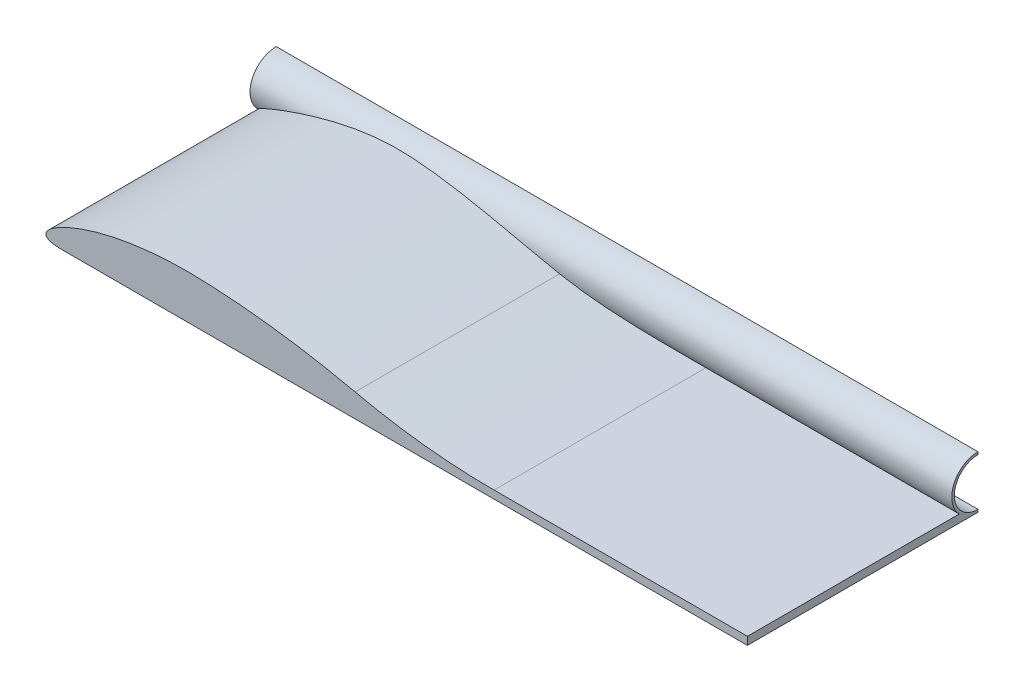
ISO-10303-21;
HEADER;
FILE_DESCRIPTION(('STEP AP214'),'2;1');
FILE_NAME('part.step','',(''),(''),'','','');
FILE_SCHEMA(('AUTOMOTIVE_DESIGN { 1 0 10303 214 1 1 1 1 }'));
ENDSEC;
DATA;
#1=APPLICATION_CONTEXT('core data for automotive mechanical design processes');
#2=APPLICATION_PROTOCOL_DEFINITION('international standard','automotive_design',2000,#1);
#3=PRODUCT_CONTEXT('',#1,'mechanical');
#4=PRODUCT('Part','Part','',(#3));
#5=PRODUCT_RELATED_PRODUCT_CATEGORY('part','',(#4));
#6=PRODUCT_DEFINITION_FORMATION('','',#4);
#7=PRODUCT_DEFINITION_CONTEXT('part definition',#1,'design');
#8=PRODUCT_DEFINITION('design','',#6,#7);
#9=PRODUCT_DEFINITION_SHAPE('','',#8);
#10=(LENGTH_UNIT() NAMED_UNIT(*) SI_UNIT(.MILLI.,.METRE.));
#11=(NAMED_UNIT(*) PLANE_ANGLE_UNIT() SI_UNIT($,.RADIAN.));
#12=(NAMED_UNIT(*) SI_UNIT($,.STERADIAN.) SOLID_ANGLE_UNIT());
#13=UNCERTAINTY_MEASURE_WITH_UNIT(LENGTH_MEASURE(1.E-05),#10,'distance_accuracy_value','');
#14=(GEOMETRIC_REPRESENTATION_CONTEXT(3) GLOBAL_UNCERTAINTY_ASSIGNED_CONTEXT((#13)) GLOBAL_UNIT_ASSIGNED_CONTEXT((#10,
#11,#12)) REPRESENTATION_CONTEXT('',''));
#15=CARTESIAN_POINT('',(0.,0.,0.));
#16=DIRECTION('',(0.,0.,1.));
#17=DIRECTION('',(1.,0.,0.));
#18=AXIS2_PLACEMENT_3D('',#15,#16,#17);
#19=CARTESIAN_POINT('',(0.,0.,0.));
#20=DIRECTION('',(0.,0.,1.));
#21=DIRECTION('',(1.,0.,0.));
#22=AXIS2_PLACEMENT_3D('',#19,#20,#21);
#23=PLANE('',#22);
#24=DIRECTION('',(0.,1.,0.));
#25=VECTOR('',#24,1.);
#26=CARTESIAN_POINT('',(563.88,0.,0.));
#27=LINE('',#26,#25);
#28=CARTESIAN_POINT('',(563.88,36.4773533691907,0.));
#29=VERTEX_POINT('',#28);
#30=CARTESIAN_POINT('',(563.88,38.5093533691907,0.));
#31=VERTEX_POINT('',#30);
#32=EDGE_CURVE('E109',#29,#31,#27,.T.);
#33=ORIENTED_EDGE('',*,*,#32,.F.);
#34=DIRECTION('',(-1.,0.,0.));
#35=VECTOR('',#34,1.);
#36=CARTESIAN_POINT('',(563.88,36.4773533691907,0.));
#37=LINE('',#36,#35);
#38=CARTESIAN_POINT('',(-0.366692026212409,36.4773533691907,0.));
#39=VERTEX_POINT('',#38);
#40=EDGE_CURVE('E97',#29,#39,#37,.T.);
#41=ORIENTED_EDGE('',*,*,#40,.T.);
#42=DIRECTION('',(0.,1.,0.));
#43=VECTOR('',#42,1.);
#44=CARTESIAN_POINT('',(-0.366692026212367,-3.65464663080933,0.));
#45=LINE('',#44,#43);
#46=CARTESIAN_POINT('',(-0.366692026212367,38.5093533691907,0.));
#47=VERTEX_POINT('',#46);
#48=EDGE_CURVE('E214',#39,#47,#45,.T.);
#49=ORIENTED_EDGE('',*,*,#48,.T.);
#50=DIRECTION('',(-1.,0.,0.));
#51=VECTOR('',#50,1.);
#52=CARTESIAN_POINT('',(563.88,38.5093533691907,0.));
#53=LINE('',#52,#51);
#54=EDGE_CURVE('E116',#31,#47,#53,.T.);
#55=ORIENTED_EDGE('',*,*,#54,.F.);
#56=EDGE_LOOP('',(#33,#41,#49,#55));
#57=FACE_BOUND('',#56,.T.);
#58=ADVANCED_FACE('F35',(#57),#23,.F.);
#59=CARTESIAN_POINT('',(0.,2.69535336919036,185.42));
#60=DIRECTION('',(0.,-1.,0.));
#61=DIRECTION('',(1.,0.,0.));
#62=AXIS2_PLACEMENT_3D('',#59,#60,#61);
#63=PLANE('',#62);
#64=DIRECTION('',(-1.,0.,0.));
#65=VECTOR('',#64,1.);
#66=CARTESIAN_POINT('',(563.88,2.69535336919067,15.0804144505382));
#67=LINE('',#66,#65);
#68=CARTESIAN_POINT('',(360.180421151929,2.69535336919025,15.0804144505377));
#69=VERTEX_POINT('',#68);
#70=CARTESIAN_POINT('',(563.88,2.69535336919067,15.0804144505382));
#71=VERTEX_POINT('',#70);
#72=EDGE_CURVE('E121',#69,#71,#67,.F.);
#73=ORIENTED_EDGE('',*,*,#72,.F.);
#74=DIRECTION('',(0.,0.,1.));
#75=VECTOR('',#74,1.);
#76=CARTESIAN_POINT('',(360.180421151928,2.69535336919056,185.42));
#77=LINE('',#76,#75);
#78=CARTESIAN_POINT('',(360.180421151928,2.69535336919056,185.42));
#79=VERTEX_POINT('',#78);
#80=EDGE_CURVE('E137',#69,#79,#77,.T.);
#81=ORIENTED_EDGE('',*,*,#80,.T.);
#82=DIRECTION('',(-1.,0.,0.));
#83=VECTOR('',#82,1.);
#84=CARTESIAN_POINT('',(0.,2.69535336919036,185.42));
#85=LINE('',#84,#83);
#86=CARTESIAN_POINT('',(563.88,2.69535336919067,185.42));
#87=VERTEX_POINT('',#86);
#88=EDGE_CURVE('E120',#87,#79,#85,.T.);
#89=ORIENTED_EDGE('',*,*,#88,.F.);
#90=DIRECTION('',(0.,0.,-1.));
#91=VECTOR('',#90,1.);
#92=CARTESIAN_POINT('',(563.88,2.69535336919067,185.42));
#93=LINE('',#92,#91);
#94=EDGE_CURVE('E125',#87,#71,#93,.T.);
#95=ORIENTED_EDGE('',*,*,#94,.T.);
#96=EDGE_LOOP('',(#73,#81,#89,#95));
#97=FACE_BOUND('',#96,.T.);
#98=ADVANCED_FACE('F174',(#97),#63,.F.);
#99=CARTESIAN_POINT('',(304.8,0.,185.42));
#100=CARTESIAN_POINT('',(304.806765113415,0.0297936907438,185.42));
#101=CARTESIAN_POINT('',(303.042265442166,0.505757681104882,185.42));
#102=CARTESIAN_POINT('',(301.260699107524,1.13128828679422,185.42));
#103=CARTESIAN_POINT('',(296.859481645383,2.43138214292342,185.42));
#104=CARTESIAN_POINT('',(291.428347563501,4.05950750692163,185.42));
#105=CARTESIAN_POINT('',(284.271481229636,6.10623828707882,185.42));
#106=CARTESIAN_POINT('',(275.759062516084,8.44101190552645,185.42));
#107=CARTESIAN_POINT('',(265.867595029522,11.0139121726236,185.42));
#108=CARTESIAN_POINT('',(254.72828410266,13.7239516275996,185.42));
#109=CARTESIAN_POINT('',(242.45219776627,16.501342019607,185.42));
#110=CARTESIAN_POINT('',(229.161916522714,19.2494538440017,185.42));
#111=CARTESIAN_POINT('',(215.002240334106,21.8918598082205,185.42));
#112=CARTESIAN_POINT('',(200.122077246214,24.3476644337164,185.42));
#113=CARTESIAN_POINT('',(184.681833301631,26.5449418917091,185.42));
#114=CARTESIAN_POINT('',(168.851714947921,28.4233907056108,185.42));
#115=CARTESIAN_POINT('',(152.808183208541,29.930661937332,185.42));
#116=CARTESIAN_POINT('',(136.726583628561,31.0048710051825,185.42));
#117=CARTESIAN_POINT('',(120.705050439528,31.6889083800929,185.42));
#118=CARTESIAN_POINT('',(104.91367571592,31.6961733177902,185.42));
#119=CARTESIAN_POINT('',(89.5648924045714,30.8862286831657,185.42));
#120=CARTESIAN_POINT('',(74.9378034426248,29.3709102924395,185.42));
#121=CARTESIAN_POINT('',(61.2207309550213,27.2233169079844,185.42));
#122=CARTESIAN_POINT('',(48.5867513337238,24.5540455106148,185.42));
#123=CARTESIAN_POINT('',(37.1861333906392,21.5011014723962,185.42));
#124=CARTESIAN_POINT('',(27.1552746614983,18.1970778873359,185.42));
#125=CARTESIAN_POINT('',(18.5969283006425,14.8044671458805,185.42));
#126=CARTESIAN_POINT('',(11.6063717286755,11.4360388322654,185.42));
#127=CARTESIAN_POINT('',(6.20537461581932,8.26316028915888,185.42));
#128=CARTESIAN_POINT('',(2.4620711553724,5.3102193566351,185.42));
#129=CARTESIAN_POINT('',(0.172825892274397,2.71807809904705,185.42));
#130=CARTESIAN_POINT('',(-0.366692026212387,-0.106725709936372,185.42));
#131=CARTESIAN_POINT('',(1.61853864418734,-2.17519153343636,185.42));
#132=CARTESIAN_POINT('',(4.90312913802598,-3.1117877974165,185.42));
#133=CARTESIAN_POINT('',(9.54050066961738,-3.65904451106276,185.42));
#134=CARTESIAN_POINT('',(15.6223250235567,-3.68468011379504,185.42));
#135=CARTESIAN_POINT('',(23.0877165309997,-3.30949507157914,185.42));
#136=CARTESIAN_POINT('',(31.8617424793389,-2.56072504363965,185.42));
#137=CARTESIAN_POINT('',(41.8437098749915,-1.53618962834286,185.42));
#138=CARTESIAN_POINT('',(52.9319861205823,-0.324549042889645,185.42));
#139=CARTESIAN_POINT('',(65.0085126482625,0.982737612858198,185.42));
#140=CARTESIAN_POINT('',(77.9641225568185,2.27751163277432,185.42));
#141=CARTESIAN_POINT('',(91.6740314858693,3.44660128053989,185.42));
#142=CARTESIAN_POINT('',(106.020407657375,4.41212483885966,185.42));
#143=CARTESIAN_POINT('',(120.95534562256,5.05177624345621,185.42));
#144=CARTESIAN_POINT('',(136.33914130998,5.41029723383236,185.42));
#145=CARTESIAN_POINT('',(152.007716340095,5.72933017095042,185.42));
#146=CARTESIAN_POINT('',(167.715786189237,5.89135553497832,185.42));
#147=CARTESIAN_POINT('',(183.286749282816,5.90781947795733,185.42));
#148=CARTESIAN_POINT('',(198.553027184666,5.75950083301546,185.42));
#149=CARTESIAN_POINT('',(213.347799024157,5.45737661505621,185.42));
#150=CARTESIAN_POINT('',(227.508384673819,5.01338248731081,185.42));
#151=CARTESIAN_POINT('',(240.877077650288,4.45854649480439,185.42));
#152=CARTESIAN_POINT('',(253.302348041566,3.81956254234677,185.42));
#153=CARTESIAN_POINT('',(264.636493620716,3.14064435260617,185.42));
#154=CARTESIAN_POINT('',(274.759317931257,2.45167335072776,185.42));
#155=CARTESIAN_POINT('',(283.511762664263,1.80333800911344,185.42));
#156=CARTESIAN_POINT('',(290.902443864489,1.20739442477992,185.42));
#157=CARTESIAN_POINT('',(296.536660630331,0.742433739926797,185.42));
#158=CARTESIAN_POINT('',(301.097723541562,0.310240549260641,185.42));
#159=CARTESIAN_POINT('',(302.984341567181,0.206591885939164,185.42));
#160=CARTESIAN_POINT('',(304.793276654245,-0.0296097451566188,185.42));
#161=CARTESIAN_POINT('',(304.8,0.,185.42));
#162=B_SPLINE_CURVE_WITH_KNOTS('',3,(#99,#100,#101,#102,#103,#104,#105,#106,#107,#108,#109,#110,
#111,#112,#113,#114,#115,#116,#117,#118,#119,#120,#121,#122,#123,#124,#125,#126,#127,#128,#129,
#130,#131,#132,#133,#134,#135,#136,#137,#138,#139,#140,#141,#142,#143,#144,#145,#146,#147,#148,
#149,#150,#151,#152,#153,#154,#155,#156,#157,#158,#159,#160,#161),.UNSPECIFIED.,.T.,.F.,(4,1,1,
1,1,1,1,1,1,1,1,1,1,1,1,1,1,1,1,1,1,1,1,1,1,1,1,1,1,1,1,1,1,1,1,1,1,1,1,1,1,1,1,1,1,1,1,1,1,1,1,
1,1,1,1,1,1,1,1,1,4),(0.,0.00137455348322331,0.00548449728179396,0.0122733609908927,
0.021682195504866,0.0335806119079948,0.0478307427867091,0.0643059527211734,0.082777332043007,
0.103063756455997,0.124929016786915,0.148149110667858,0.172444694611559,0.197572105868171,
0.223268880537162,0.249227774933554,0.275186209349679,0.300900708934774,0.326462938278696,
0.351222485186767,0.374905858971967,0.397269706218861,0.418072413969665,0.437079533175026,
0.454093093767394,0.468919631578705,0.48139171235289,0.491447126518173,0.499023571234557,
0.504293734329401,0.507921918342,0.511539686153778,0.516780527527172,0.524216490268905,
0.533991629403711,0.546033957270731,0.560220284382465,0.576403357410148,0.594370816485922,
0.613951103581465,0.634916884969972,0.657088503485648,0.680229909573905,0.704175481107386,
0.72909036740664,0.754353775526935,0.779667752347888,0.804760119952374,0.829359338708984,
0.853208710008459,0.876041363199166,0.897604065496152,0.917662212410958,0.935969860405553,
0.952309787739252,0.966502759006892,0.978350082728452,0.987731492337842,0.994510920242662,
0.998633932979557,1.),.UNSPECIFIED.);
#163=DIRECTION('',(0.,0.,-1.));
#164=VECTOR('',#163,1.);
#165=SURFACE_OF_LINEAR_EXTRUSION('',#162,#164);
#166=CARTESIAN_POINT('',(248.468052168918,15.1306788652424,20.9565266736383));
#167=CARTESIAN_POINT('',(247.099112764868,15.4393030736697,20.9903312593925));
#168=CARTESIAN_POINT('',(245.729105769636,15.7439384634841,21.0168359582006));
#169=CARTESIAN_POINT('',(242.98715958145,16.3451319217436,21.0563639623265));
#170=CARTESIAN_POINT('',(241.615220436294,16.6416901864393,21.0693875954799));
#171=CARTESIAN_POINT('',(238.869528993161,17.2266484245325,21.0830734704658));
#172=CARTESIAN_POINT('',(237.495776672501,17.5150482948292,21.0837355561505));
#173=CARTESIAN_POINT('',(234.746598439609,18.0837493381834,21.0736982455053));
#174=CARTESIAN_POINT('',(233.371172479316,18.3640502726612,21.0629985148272));
#175=CARTESIAN_POINT('',(230.618784230446,18.9165921609464,21.0311546658974));
#176=CARTESIAN_POINT('',(229.241821898425,19.1888328805205,21.0100102444336));
#177=CARTESIAN_POINT('',(226.478603793566,19.726789216564,20.9579759444772));
#178=CARTESIAN_POINT('',(225.092340035387,19.9924584219975,20.9270308362591));
#179=CARTESIAN_POINT('',(222.318490622957,20.5155577262323,20.8562551608536));
#180=CARTESIAN_POINT('',(220.930904972023,20.7729878456534,20.8164246159054));
#181=CARTESIAN_POINT('',(218.154524449685,21.279539448282,20.7286626418));
#182=CARTESIAN_POINT('',(216.765729621149,21.5286612146448,20.6807314890565));
#183=CARTESIAN_POINT('',(213.987042349249,22.0185235511418,20.5775249179119));
#184=CARTESIAN_POINT('',(212.597149995387,22.2592647444273,20.5222500470436));
#185=CARTESIAN_POINT('',(209.816387956572,22.7323048063502,20.405086884718));
#186=CARTESIAN_POINT('',(208.425518412209,22.9646047056129,20.3431994042764));
#187=CARTESIAN_POINT('',(203.687559953128,23.741206574207,20.1224069564179));
#188=CARTESIAN_POINT('',(200.337783470012,24.2652725829196,19.9493673129411));
#189=CARTESIAN_POINT('',(193.632531070939,25.2637601399526,19.5786866855983));
#190=CARTESIAN_POINT('',(190.277055644433,25.7381857522002,19.3810477185187));
#191=CARTESIAN_POINT('',(183.559693279163,26.637016380202,18.9704207944893));
#192=CARTESIAN_POINT('',(180.197805254609,27.0614119848369,18.7574299618118));
#193=CARTESIAN_POINT('',(175.150007571353,27.659738281782,18.4336790308048));
#194=CARTESIAN_POINT('',(173.46621229796,27.8528405361202,18.3250270676343));
#195=CARTESIAN_POINT('',(170.097202157166,28.2261269124803,18.1075634703754));
#196=CARTESIAN_POINT('',(168.411987294777,28.4063110799192,17.9987518368499));
#197=CARTESIAN_POINT('',(165.038988742346,28.753632145901,17.7822392233363));
#198=CARTESIAN_POINT('',(163.351204086217,28.9207601574512,17.6745390424266));
#199=CARTESIAN_POINT('',(159.974167283502,29.2413958652244,17.4618481346871));
#200=CARTESIAN_POINT('',(158.284915137923,29.3949035707906,17.3568574059988));
#201=CARTESIAN_POINT('',(155.749114612704,29.6147238866339,17.2025217419631));
#202=CARTESIAN_POINT('',(154.903116246161,29.6862893189819,17.1515776284693));
#203=CARTESIAN_POINT('',(153.210748829141,29.8258455257327,17.050968112794));
#204=CARTESIAN_POINT('',(152.364379778751,29.8938363009811,17.00130271031));
#205=CARTESIAN_POINT('',(149.824732837935,30.0924564399656,16.8544661467356));
#206=CARTESIAN_POINT('',(148.130908282572,30.2177342131065,16.7594542082649));
#207=CARTESIAN_POINT('',(144.751165423068,30.4538681438065,16.5765743088214));
#208=CARTESIAN_POINT('',(143.065254296047,30.5647991228635,16.4886702611101));
#209=CARTESIAN_POINT('',(140.535497050204,30.7213018720414,16.3623390588263));
#210=CARTESIAN_POINT('',(139.692091942442,30.7718207322824,16.3211492753199));
#211=CARTESIAN_POINT('',(138.005003288597,30.8696319326705,16.2406863404359));
#212=CARTESIAN_POINT('',(137.161319742291,30.9169242702283,16.2014131905965));
#213=CARTESIAN_POINT('',(134.629336651519,31.0539885921662,16.0866300822614));
#214=CARTESIAN_POINT('',(132.940628434794,31.1389155038095,16.0141827595993));
#215=CARTESIAN_POINT('',(129.562002759127,31.2926329082582,15.8812824243957));
#216=CARTESIAN_POINT('',(127.872085310135,31.3614235323534,15.8208293142663));
#217=CARTESIAN_POINT('',(124.492561356313,31.4797032865268,15.7158665657651));
#218=CARTESIAN_POINT('',(122.802955914565,31.52920954926,15.6713427783105));
#219=CARTESIAN_POINT('',(119.422806870354,31.6058021333431,15.602084412551));
#220=CARTESIAN_POINT('',(117.732263265546,31.6328883983895,15.5773498839431));
#221=CARTESIAN_POINT('',(114.3528682068,31.6624941981846,15.5503042607257));
#222=CARTESIAN_POINT('',(112.664017291064,31.6650445138589,15.5479650706552));
#223=CARTESIAN_POINT('',(110.130998581018,31.6489812960987,15.5626478946982));
#224=CARTESIAN_POINT('',(109.286699683187,31.6403120582089,15.5705741500456));
#225=CARTESIAN_POINT('',(107.598278875806,31.6160959896825,15.5926454963197));
#226=CARTESIAN_POINT('',(106.754156966041,31.600549167477,15.6067905796232));
#227=CARTESIAN_POINT('',(105.066857319297,31.5623127168644,15.6414293414338));
#228=CARTESIAN_POINT('',(104.223679356776,31.5396286174967,15.6619181054821));
#229=CARTESIAN_POINT('',(102.537728038733,31.4870156943186,15.7091645881915));
#230=CARTESIAN_POINT('',(101.694954683603,31.4570868635079,15.7359223129099));
#231=CARTESIAN_POINT('',(99.1673713850292,31.3565071872956,15.8252191175723));
#232=CARTESIAN_POINT('',(97.4832919611766,31.2750630163911,15.8967819593659));
#233=CARTESIAN_POINT('',(94.1183585926019,31.0836100831535,16.0615460701563));
#234=CARTESIAN_POINT('',(92.4375038113685,30.9736101633857,16.1547406397339));
#235=CARTESIAN_POINT('',(89.9186814431363,30.7873667410885,16.3085012353868));
#236=CARTESIAN_POINT('',(89.0794823739226,30.7217448660866,16.3620830050465));
#237=CARTESIAN_POINT('',(87.4019551736037,30.5833984812229,16.4735272253018));
#238=CARTESIAN_POINT('',(86.5636270399786,30.5106739919689,16.5313896634773));
#239=CARTESIAN_POINT('',(84.5125395286841,30.3238253765889,16.6778735879811));
#240=CARTESIAN_POINT('',(83.3002925535145,30.2057504219486,16.7686618048924));
#241=CARTESIAN_POINT('',(80.8779681137182,29.9542293572377,16.9573823202409));
#242=CARTESIAN_POINT('',(79.6678906260886,29.820783411135,17.0553145424662));
#243=CARTESIAN_POINT('',(77.2492648956912,29.5381482353492,17.2571592486098));
#244=CARTESIAN_POINT('',(76.0407181773908,29.3889487327877,17.3610756144549));
#245=CARTESIAN_POINT('',(73.6261031432983,29.0745987726564,17.5735137438798));
#246=CARTESIAN_POINT('',(72.4200348352933,28.9094482650475,17.6820355219064));
#247=CARTESIAN_POINT('',(70.0097790842015,28.562771233046,17.9023854032609));
#248=CARTESIAN_POINT('',(68.8055932921325,28.3812345173747,18.0142155347256));
#249=CARTESIAN_POINT('',(66.4000128898592,28.0015463227288,18.2396797245532));
#250=CARTESIAN_POINT('',(65.1986182784036,27.8033948512045,18.3533137821071));
#251=CARTESIAN_POINT('',(62.7980243610373,27.3900185139923,18.5809509157368));
#252=CARTESIAN_POINT('',(61.5988268940342,27.1747830660028,18.6949541779101));
#253=CARTESIAN_POINT('',(59.2035470578654,26.7269953655821,18.9216904879018));
#254=CARTESIAN_POINT('',(58.0074646870889,26.494443122106,19.034423536377));
#255=CARTESIAN_POINT('',(55.6191680501046,26.0116865837907,19.2569614376926));
#256=CARTESIAN_POINT('',(54.4269522574135,25.7614904596922,19.3667676138999));
#257=CARTESIAN_POINT('',(52.0460652406215,25.2428909182544,19.5817998184992));
#258=CARTESIAN_POINT('',(50.8573940253433,24.9744874556351,19.6870258354996));
#259=CARTESIAN_POINT('',(48.4842374396399,24.4191694851651,19.8910214003124));
#260=CARTESIAN_POINT('',(47.2997508182784,24.1322611099898,19.9897930655238));
#261=CARTESIAN_POINT('',(44.9349623602635,23.5391022201909,20.1790531938305));
#262=CARTESIAN_POINT('',(43.7546605023463,23.2328518039985,20.2695416990728));
#263=CARTESIAN_POINT('',(41.3997891521572,22.6002912901074,20.4401233852523));
#264=CARTESIAN_POINT('',(40.225215552053,22.2739989548532,20.5202255807644));
#265=CARTESIAN_POINT('',(37.8813221161396,21.6002236220635,20.667773035816));
#266=CARTESIAN_POINT('',(36.7120023783765,21.2527402308152,20.7352180601003));
#267=CARTESIAN_POINT('',(34.3801580163397,20.5357940626232,20.8547438472018));
#268=CARTESIAN_POINT('',(33.2176294378908,20.1663458527581,20.9068346593151));
#269=CARTESIAN_POINT('',(30.8996287895528,19.4040048319452,20.9926354825125));
#270=CARTESIAN_POINT('',(29.7441562812054,19.0111134944166,21.0263466474247));
#271=CARTESIAN_POINT('',(28.1609204401472,18.4539310867058,21.0575399033757));
#272=CARTESIAN_POINT('',(27.7296000620704,18.300203132616,21.0644975269429));
#273=CARTESIAN_POINT('',(26.868187589711,17.989244063447,21.0750850032511));
#274=CARTESIAN_POINT('',(26.4380954830201,17.8320129838993,21.0787148897291));
#275=CARTESIAN_POINT('',(25.1497543288994,17.3548244295112,21.0842784208201));
#276=CARTESIAN_POINT('',(24.2934918443509,17.0293896905407,21.0808848716959));
#277=CARTESIAN_POINT('',(22.5873162475846,16.3623211828166,21.057726153146));
#278=CARTESIAN_POINT('',(21.7374043476888,16.0206844081658,21.0379579345047));
#279=CARTESIAN_POINT('',(20.0485993198864,15.3211554943467,20.979451129247));
#280=CARTESIAN_POINT('',(19.2096771328529,14.9633278799521,20.9407827011848));
#281=CARTESIAN_POINT('',(17.5413803292936,14.2290996288189,20.841288691655));
#282=CARTESIAN_POINT('',(16.712004409275,13.8527015657888,20.7804661731427));
#283=CARTESIAN_POINT('',(15.4770548517145,13.2728584375797,20.6695301810819));
#284=CARTESIAN_POINT('',(15.0669817172029,13.0770653141531,20.6292749389475));
#285=CARTESIAN_POINT('',(14.2501822769942,12.6801754107013,20.5415764990661));
#286=CARTESIAN_POINT('',(13.8434558927213,12.4790787556624,20.4941334705862));
#287=CARTESIAN_POINT('',(13.1618635311451,12.1359258966031,20.4076493086353));
#288=CARTESIAN_POINT('',(12.8859981237364,11.9953231791236,20.370700019397));
#289=CARTESIAN_POINT('',(12.3361588638315,11.7115201712671,20.2928959588571));
#290=CARTESIAN_POINT('',(12.0621850057976,11.5683198884989,20.2520411989941));
#291=CARTESIAN_POINT('',(11.5162324517187,11.279299229351,20.1661817069372));
#292=CARTESIAN_POINT('',(11.2442540000527,11.1334785393493,20.1211764752971));
#293=CARTESIAN_POINT('',(10.7025445289864,10.8391217502256,20.0267279462486));
#294=CARTESIAN_POINT('',(10.4328135048442,10.690585656835,19.9772846582067));
#295=CARTESIAN_POINT('',(9.89443079653266,10.3894936998747,19.8732176903685));
#296=CARTESIAN_POINT('',(9.62579511818293,10.2369191590751,19.8185649006422));
#297=CARTESIAN_POINT('',(9.09170217802112,9.92829251524886,19.7038544428412));
#298=CARTESIAN_POINT('',(8.82624495906186,9.7722403654172,19.6437967019884));
#299=CARTESIAN_POINT('',(8.03551661855911,9.29848842236969,19.4547723205064));
#300=CARTESIAN_POINT('',(7.51567311905697,8.97507343407394,19.3169137860103));
#301=CARTESIAN_POINT('',(6.7461879346282,8.47471203430509,19.0875664460566));
#302=CARTESIAN_POINT('',(6.48935400986463,8.30392732031769,19.0066016301604));
#303=CARTESIAN_POINT('',(5.98126251784846,7.95799049615125,18.8366421013234));
#304=CARTESIAN_POINT('',(5.73000576711389,7.78283775434496,18.7476462221423));
#305=CARTESIAN_POINT('',(5.23389430844291,7.42794718839828,18.5607875763484));
#306=CARTESIAN_POINT('',(4.98904274611483,7.24820719397614,18.4629205546546));
#307=CARTESIAN_POINT('',(4.50675956728217,6.88376943006438,18.2572558156252));
#308=CARTESIAN_POINT('',(4.26933780820467,6.69906563218346,18.149445597));
#309=CARTESIAN_POINT('',(3.80583756662264,6.32688263339939,17.924204131063));
#310=CARTESIAN_POINT('',(3.57966778885662,6.13945125624239,17.8068827727726));
#311=CARTESIAN_POINT('',(3.24794326026086,5.85511898536105,17.6223401833388));
#312=CARTESIAN_POINT('',(3.1386222123292,5.7598095668148,17.5593984461064));
#313=CARTESIAN_POINT('',(2.92263148571995,5.56818930766246,17.4305560135163));
#314=CARTESIAN_POINT('',(2.81596176895711,5.47187848146938,17.3646553607003));
#315=CARTESIAN_POINT('',(2.60556685312168,5.27847494672249,17.2298969203662));
#316=CARTESIAN_POINT('',(2.50183770300641,5.18138353662086,17.1610434469137));
#317=CARTESIAN_POINT('',(2.34844564124036,5.03512951152962,17.0554134663737));
#318=CARTESIAN_POINT('',(2.29767932388815,4.98627280342645,17.0198099383418));
#319=CARTESIAN_POINT('',(2.19688609345535,4.88837669745407,16.9478163610146));
#320=CARTESIAN_POINT('',(2.14685918274869,4.83933729899895,16.9114263091951));
#321=CARTESIAN_POINT('',(1.99817777646345,4.69203387140731,16.8011133754483));
#322=CARTESIAN_POINT('',(1.90076779756164,4.59343755743372,16.7259416290053));
#323=CARTESIAN_POINT('',(1.71034712955726,4.39500542595423,16.5717954616821));
#324=CARTESIAN_POINT('',(1.6173355889835,4.29516985311354,16.4928217828216));
#325=CARTESIAN_POINT('',(1.44202770109712,4.09999093898634,16.3354493109147));
#326=CARTESIAN_POINT('',(1.35942295410864,4.00473072419662,16.2572922751238));
#327=CARTESIAN_POINT('',(1.19979679083388,3.81294419785355,16.0970243853798));
#328=CARTESIAN_POINT('',(1.12277308704261,3.71641842439311,16.0149151745366));
#329=CARTESIAN_POINT('',(0.974988358989928,3.52220848894599,15.8465824534736));
#330=CARTESIAN_POINT('',(0.904225809151934,3.42452461575345,15.7603599534117));
#331=CARTESIAN_POINT('',(0.769505004761096,3.22822834829591,15.5837415540541));
#332=CARTESIAN_POINT('',(0.705546865822586,3.12961593828504,15.4933455838839));
#333=CARTESIAN_POINT('',(0.584799154945228,2.93178923519666,15.3084186674267));
#334=CARTESIAN_POINT('',(0.528012402692753,2.83257472135013,15.2138861142433));
#335=CARTESIAN_POINT('',(0.421821123112524,2.63400755958219,15.0208792540081));
#336=CARTESIAN_POINT('',(0.372417355132203,2.53465489851139,14.9224045428201));
#337=CARTESIAN_POINT('',(0.280811795277042,2.33596262654509,14.7214361372196));
#338=CARTESIAN_POINT('',(0.238634506096255,2.23662415833613,14.6189301639498));
#339=CARTESIAN_POINT('',(0.161540626066773,2.0387482225775,14.4104895039303));
#340=CARTESIAN_POINT('',(0.126623554472804,1.9402107024074,14.3045550447397));
#341=CARTESIAN_POINT('',(0.0641246243668774,1.74429929091532,14.0894888883517));
#342=CARTESIAN_POINT('',(0.0365428870153904,1.64692541883911,13.9803571383765));
#343=CARTESIAN_POINT('',(-0.0110926308184131,1.4538037278131,13.7592860304731));
#344=CARTESIAN_POINT('',(-0.0311553458544166,1.35805410888473,13.6473501744472));
#345=CARTESIAN_POINT('',(-0.0635541480746262,1.16839232315002,13.4208319138483));
#346=CARTESIAN_POINT('',(-0.0758903396037608,1.07448013154624,13.3062495450374));
#347=CARTESIAN_POINT('',(-0.0925262154443618,0.888799221626655,13.0747455189002));
#348=CARTESIAN_POINT('',(-0.09682446227413,0.797030889609472,12.9578234469264));
#349=CARTESIAN_POINT('',(-0.0970076141094968,0.615110229062553,12.7209168424299));
#350=CARTESIAN_POINT('',(-0.0928109113582904,0.52498204813617,12.6009136434611));
#351=CARTESIAN_POINT('',(-0.07538322805831,0.347615393187304,12.3594377909034));
#352=CARTESIAN_POINT('',(-0.0621537303527659,0.260376447326,12.2379653817177));
#353=CARTESIAN_POINT('',(-0.0351654960967089,0.131987647614654,12.0551482428751));
#354=CARTESIAN_POINT('',(-0.0249813789810078,0.0896108386049936,11.9941194844675));
#355=CARTESIAN_POINT('',(-0.00213614411311007,0.00571639336966007,11.8719323953397));
#356=CARTESIAN_POINT('',(0.0105249422586308,-0.0358012537332748,11.8107740662707));
#357=CARTESIAN_POINT('',(0.0382925783671819,-0.118051131918416,11.6882404684464));
#358=CARTESIAN_POINT('',(0.0534055810059697,-0.15878096412908,11.6268650570911));
#359=CARTESIAN_POINT('',(0.0858861994660794,-0.239324829933427,11.5041121067128));
#360=CARTESIAN_POINT('',(0.103253867770717,-0.27913884218357,11.4427345676737));
#361=CARTESIAN_POINT('',(0.158549826701108,-0.397232466348643,11.2586025168384));
#362=CARTESIAN_POINT('',(0.199658627421978,-0.47412753752829,11.1359024442689));
#363=CARTESIAN_POINT('',(0.289292994670165,-0.624214718728156,10.890925833953));
#364=CARTESIAN_POINT('',(0.337821044294873,-0.697405578054606,10.7686494520727));
#365=CARTESIAN_POINT('',(0.461593746020229,-0.868015119158188,10.4770620629348));
#366=CARTESIAN_POINT('',(0.539869537456908,-0.963729046603457,10.3080370931815));
#367=CARTESIAN_POINT('',(0.706950522830006,-1.14834321633418,9.9715128591809));
#368=CARTESIAN_POINT('',(0.795756755010934,-1.23724278533569,9.80401374713089));
#369=CARTESIAN_POINT('',(0.982481247908242,-1.40855811656232,9.47070603597173));
#370=CARTESIAN_POINT('',(1.0804025512969,-1.49097169665662,9.3048980220037));
#371=CARTESIAN_POINT('',(1.23338377872157,-1.60983788828797,9.05783726091451));
#372=CARTESIAN_POINT('',(1.28536954607707,-1.64865135171054,8.97579507336055));
#373=CARTESIAN_POINT('',(1.39134079926786,-1.72473363559898,8.81228798840193));
#374=CARTESIAN_POINT('',(1.44532628145108,-1.76200245888557,8.73082308994329));
#375=CARTESIAN_POINT('',(1.61026984330001,-1.87147123093847,8.48750269709507));
#376=CARTESIAN_POINT('',(1.72426092148852,-1.94136911965673,8.32664723993351));
#377=CARTESIAN_POINT('',(1.96069508562229,-2.07500071730861,8.00866120136738));
#378=CARTESIAN_POINT('',(2.08313702069027,-2.13873526276775,7.85153011666044));
#379=CARTESIAN_POINT('',(2.32025205106857,-2.25223508422951,7.56210637455543));
#380=CARTESIAN_POINT('',(2.43386905446269,-2.30273959946211,7.42923809036316));
#381=CARTESIAN_POINT('',(2.66768414901469,-2.39923927601535,7.167731432319));
#382=CARTESIAN_POINT('',(2.78788184893629,-2.44523470495795,7.03909280773116));
#383=CARTESIAN_POINT('',(3.0345605518836,-2.53287975377603,6.78658082770482));
#384=CARTESIAN_POINT('',(3.16103841115464,-2.57453151628943,6.66270514203081));
#385=CARTESIAN_POINT('',(3.41984347362072,-2.65384408900789,6.41970311679895));
#386=CARTESIAN_POINT('',(3.55217482358797,-2.69150200355551,6.30058026169239));
#387=CARTESIAN_POINT('',(3.82163818650017,-2.7632583887707,6.06670544129596));
#388=CARTESIAN_POINT('',(3.95877186717934,-2.79735560619194,5.95195502392289));
#389=CARTESIAN_POINT('',(4.16693383352442,-2.84629242621028,5.78216817000317));
#390=CARTESIAN_POINT('',(4.23675026304535,-2.86224047317156,5.72594772921973));
#391=CARTESIAN_POINT('',(4.37693713701115,-2.89349525610219,5.61401958031891));
#392=CARTESIAN_POINT('',(4.44730758943695,-2.9088019828129,5.55831187961293));
#393=CARTESIAN_POINT('',(4.64334238126854,-2.95055734885076,5.40388311119408));
#394=CARTESIAN_POINT('',(4.76937397438942,-2.97639608534521,5.30546277106496));
#395=CARTESIAN_POINT('',(5.02256434896766,-3.02631579417228,5.10963395828651));
#396=CARTESIAN_POINT('',(5.14972312830085,-3.05039676981662,5.01222548373107));
#397=CARTESIAN_POINT('',(5.53279106801946,-3.12006310646252,4.7216585807943));
#398=CARTESIAN_POINT('',(5.79037967048077,-3.16309052687104,4.53008936952587));
#399=CARTESIAN_POINT('',(6.30997439882075,-3.24269891231755,4.15175094107866));
#400=CARTESIAN_POINT('',(6.57197987824038,-3.27928081190638,3.96498103139795));
#401=CARTESIAN_POINT('',(7.10044914711469,-3.34644243291669,3.5965548187372));
#402=CARTESIAN_POINT('',(7.36691438745805,-3.37702015813276,3.41490023358317));
#403=CARTESIAN_POINT('',(7.90402602491006,-3.4326232281895,3.05694839654035));
#404=CARTESIAN_POINT('',(8.17467282754521,-3.45764803084829,2.88065166923661));
#405=CARTESIAN_POINT('',(8.58335651540477,-3.49139556664022,2.61998822683417));
#406=CARTESIAN_POINT('',(8.72003899148357,-3.50201328128243,2.53372926167402));
#407=CARTESIAN_POINT('',(8.99416035055496,-3.52205718583431,2.3622809274758));
#408=CARTESIAN_POINT('',(9.13159923539215,-3.53148337283695,2.27709156104774));
#409=CARTESIAN_POINT('',(9.5094669786478,-3.55577217820874,2.04479279296796));
#410=CARTESIAN_POINT('',(9.75058486876727,-3.56947377520652,1.8986796518567));
#411=CARTESIAN_POINT('',(10.2349237558423,-3.5935993442259,1.60974903052906));
#412=CARTESIAN_POINT('',(10.4781445908664,-3.60402356634333,1.46693129961163));
#413=CARTESIAN_POINT('',(10.966612734834,-3.6217965701448,1.18488957325301));
#414=CARTESIAN_POINT('',(11.2118589774766,-3.62914687648535,1.04566382842438));
#415=CARTESIAN_POINT('',(11.7045365353909,-3.64099172573271,0.771009238092358));
#416=CARTESIAN_POINT('',(11.9519678625235,-3.64548625312843,0.635580413215648));
#417=CARTESIAN_POINT('',(12.5021094623985,-3.6525210029813,0.340333266657014));
#418=CARTESIAN_POINT('',(12.8053472636224,-3.65443941449852,0.181478315621073));
#419=CARTESIAN_POINT('',(13.1272001630557,-3.65464133877349,0.017265421892696));
#420=CARTESIAN_POINT('',(13.1441551329531,-3.65464663536664,0.0086276025826738));
#421=CARTESIAN_POINT('',(13.1611152527335,-3.6546466308094,0.));
#422=B_SPLINE_CURVE_WITH_KNOTS('',3,(#166,#167,#168,#169,#170,#171,#172,#173,#174,#175,#176,
#177,#178,#179,#180,#181,#182,#183,#184,#185,#186,#187,#188,#189,#190,#191,#192,#193,#194,#195,
#196,#197,#198,#199,#200,#201,#202,#203,#204,#205,#206,#207,#208,#209,#210,#211,#212,#213,#214,
#215,#216,#217,#218,#219,#220,#221,#222,#223,#224,#225,#226,#227,#228,#229,#230,#231,#232,#233,
#234,#235,#236,#237,#238,#239,#240,#241,#242,#243,#244,#245,#246,#247,#248,#249,#250,#251,#252,
#253,#254,#255,#256,#257,#258,#259,#260,#261,#262,#263,#264,#265,#266,#267,#268,#269,#270,#271,
#272,#273,#274,#275,#276,#277,#278,#279,#280,#281,#282,#283,#284,#285,#286,#287,#288,#289,#290,
#291,#292,#293,#294,#295,#296,#297,#298,#299,#300,#301,#302,#303,#304,#305,#306,#307,#308,#309,
#310,#311,#312,#313,#314,#315,#316,#317,#318,#319,#320,#321,#322,#323,#324,#325,#326,#327,#328,
#329,#330,#331,#332,#333,#334,#335,#336,#337,#338,#339,#340,#341,#342,#343,#344,#345,#346,#347,
#348,#349,#350,#351,#352,#353,#354,#355,#356,#357,#358,#359,#360,#361,#362,#363,#364,#365,#366,
#367,#368,#369,#370,#371,#372,#373,#374,#375,#376,#377,#378,#379,#380,#381,#382,#383,#384,#385,
#386,#387,#388,#389,#390,#391,#392,#393,#394,#395,#396,#397,#398,#399,#400,#401,#402,#403,#404,
#405,#406,#407,#408,#409,#410,#411,#412,#413,#414,#415,#416,#417,#418,#419,#420,#421),
.UNSPECIFIED.,.F.,.F.,(4,2,2,2,2,2,2,2,2,2,2,2,2,2,2,2,2,2,2,2,2,2,2,2,2,2,2,2,2,2,2,2,2,2,2,2,
2,2,2,2,2,2,2,2,2,2,2,2,2,2,2,2,2,2,2,2,2,2,2,2,2,2,2,2,2,2,2,2,2,2,2,2,2,2,2,2,2,2,2,2,2,2,2,2,
2,2,2,2,2,2,2,2,2,2,2,2,2,2,2,2,2,2,2,2,2,2,2,2,2,2,2,2,2,2,2,2,2,2,2,2,2,2,2,2,2,2,2,4),(0.,
4.21107196657604,8.42204152496655,12.6330642752375,16.844210948221,21.0554798790546,
25.2909159363535,29.5263413929243,33.7616223549788,37.9965877201135,42.231034275117,
52.4152890365587,62.5987093867007,72.784042288451,77.8789356080635,82.9738110143321,
88.0721246909172,93.1704348702218,95.7220684434717,98.2737014130303,103.376946611121,
108.452400715231,110.990153429699,113.527908180699,118.604993946607,123.682038402403,
128.754561955304,133.827098246833,138.893270091234,141.4263696471,143.959466097793,
146.490605044422,149.021746436756,154.084010475081,159.144708800114,161.675067507138,
164.205418872701,167.869379673945,171.533301394019,175.199627284762,178.865964677326,
182.534598242606,186.203230162854,189.87415254325,193.545073025282,197.21430455743,
200.88354521496,204.551576043769,208.219588207587,211.884395179648,215.549270261663,
219.211741338058,222.873982467229,224.247809803201,225.621623211024,228.369413445589,
231.117715476057,233.855892269102,236.593690633998,237.962200670707,239.330678485027,
240.26612361618,241.20156600764,242.137121112664,243.072674243253,244.013801456887,
244.954941344789,246.836471742004,247.792978518232,248.749624418932,249.70673163183,
250.665059032605,251.613567897752,252.087833366013,252.562092017713,253.035679929562,
253.272498433913,253.509317698425,253.982241226949,254.455072826672,254.899965857671,
255.344675496392,255.789276478193,256.233885013042,256.67866782089,257.123496343663,
257.56980450807,258.016083110152,258.462369083128,258.908123058165,259.353871013267,
259.799698676964,260.249829561208,260.69988656875,260.924829203692,261.149768989043,
261.375310666692,261.600857595362,262.052149246863,262.503592270049,263.131389931913,
263.759249542778,264.387319494172,264.701074984975,265.014829902796,265.64205718382,
266.269199213999,266.814896946823,267.360562271922,267.905957145958,268.451744782324,
268.997723874783,269.270858518311,269.543997103683,270.02992576732,270.515853515419,
271.487368840334,272.45874318689,273.430439941089,274.402231529094,274.888143746809,
275.374057150003,276.220809824442,277.067497867656,277.913765455664,278.760037640112,
279.786922548082,279.844007961305),.UNSPECIFIED.);
#423=CARTESIAN_POINT('',(13.1611152527334,-3.65464663080933,0.));
#424=VERTEX_POINT('',#423);
#425=CARTESIAN_POINT('',(248.468052126158,15.1306788748815,20.9565266746947));
#426=VERTEX_POINT('',#425);
#427=EDGE_CURVE('E158',#424,#426,#422,.F.);
#428=ORIENTED_EDGE('',*,*,#427,.F.);
#429=DIRECTION('',(0.,0.,-1.));
#430=VECTOR('',#429,1.);
#431=CARTESIAN_POINT('',(13.1611152527335,-3.65464663080947,185.42));
#432=LINE('',#431,#430);
#433=CARTESIAN_POINT('',(13.1611152527335,-3.65464663080947,185.42));
#434=VERTEX_POINT('',#433);
#435=EDGE_CURVE('E131',#434,#424,#432,.T.);
#436=ORIENTED_EDGE('',*,*,#435,.F.);
#437=CARTESIAN_POINT('',(248.468052126158,15.1306788748816,185.42));
#438=VERTEX_POINT('',#437);
#439=EDGE_CURVE('E178',#438,#434,#162,.T.);
#440=ORIENTED_EDGE('',*,*,#439,.F.);
#441=DIRECTION('',(0.,0.,-1.));
#442=VECTOR('',#441,1.);
#443=CARTESIAN_POINT('',(248.468052126158,15.1306788748816,185.42));
#444=LINE('',#443,#442);
#445=EDGE_CURVE('E134',#438,#426,#444,.T.);
#446=ORIENTED_EDGE('',*,*,#445,.T.);
#447=EDGE_LOOP('',(#428,#436,#440,#446));
#448=FACE_BOUND('',#447,.T.);
#449=ADVANCED_FACE('F169',(#448),#165,.F.);
#450=CARTESIAN_POINT('',(360.180421151928,510.69535336919,92.7100000000001));
#451=DIRECTION('',(0.,0.,-1.));
#452=DIRECTION('',(-1.,0.,0.));
#453=AXIS2_PLACEMENT_3D('',#450,#451,#452);
#454=CYLINDRICAL_SURFACE('',#453,508.);
#455=CARTESIAN_POINT('',(248.468052126158,15.1306788748815,20.9565266746947));
#456=CARTESIAN_POINT('',(250.186683566252,14.7432565373565,20.9140363199513));
#457=CARTESIAN_POINT('',(251.907072921885,14.3648343451867,20.8617242371397));
#458=CARTESIAN_POINT('',(255.351061753137,13.6260354688682,20.7398459094202));
#459=CARTESIAN_POINT('',(257.074661130399,13.2656582409467,20.6702801848157));
#460=CARTESIAN_POINT('',(260.524463059272,12.5630536083547,20.5162990901475));
#461=CARTESIAN_POINT('',(262.250664904923,12.2208219635069,20.4318872093469));
#462=CARTESIAN_POINT('',(265.705892817042,11.5544321707494,20.2504016396582));
#463=CARTESIAN_POINT('',(267.434918907882,11.2302741796656,20.1533278409266));
#464=CARTESIAN_POINT('',(272.617763543736,10.2864247879502,19.8467888976235));
#465=CARTESIAN_POINT('',(276.075595945066,9.69367866381002,19.621617534078));
#466=CARTESIAN_POINT('',(283.001413651058,8.58012296957395,19.1453333629919));
#467=CARTESIAN_POINT('',(286.469400168837,8.05932238554403,18.8942173217705));
#468=CARTESIAN_POINT('',(292.840614860071,7.16986645505986,18.4240110147841));
#469=CARTESIAN_POINT('',(295.742440185643,6.79029182802976,18.2064882151284));
#470=CARTESIAN_POINT('',(301.552401349823,6.08132264938798,17.7733193253054));
#471=CARTESIAN_POINT('',(304.460537273043,5.75192877486834,17.5576732604981));
#472=CARTESIAN_POINT('',(310.282595716462,5.14340465432647,17.1374463765147));
#473=CARTESIAN_POINT('',(313.196517672352,4.86426972868515,16.9328645283899));
#474=CARTESIAN_POINT('',(319.030113446236,4.35631256482142,16.5439118998139));
#475=CARTESIAN_POINT('',(321.949787263405,4.12749031938911,16.3595411164664));
#476=CARTESIAN_POINT('',(327.805820565417,3.71948228786187,16.0192358025432));
#477=CARTESIAN_POINT('',(330.742200585173,3.54049465936205,15.8634156138312));
#478=CARTESIAN_POINT('',(336.619379033784,3.23349717881482,15.5893481229621));
#479=CARTESIAN_POINT('',(339.560177370476,3.1054862778443,15.4711000477122));
#480=CARTESIAN_POINT('',(343.974532271396,2.95177759731872,15.3268781529165));
#481=CARTESIAN_POINT('',(345.446913301785,2.90691895715275,15.284322122888));
#482=CARTESIAN_POINT('',(348.392306583626,2.83000644415537,15.2108857960889));
#483=CARTESIAN_POINT('',(349.865318834181,2.79795255316899,15.1800054827641));
#484=CARTESIAN_POINT('',(352.811898890771,2.74665884312568,15.1304086854482));
#485=CARTESIAN_POINT('',(354.28546673396,2.72742013782872,15.1116932587033));
#486=CARTESIAN_POINT('',(357.232829153425,2.70176696859472,15.0866790564864));
#487=CARTESIAN_POINT('',(358.706623731184,2.69535259241831,15.0803803659857));
#488=CARTESIAN_POINT('',(360.180421151929,2.69535336919028,15.0804144505378));
#489=B_SPLINE_CURVE_WITH_KNOTS('',3,(#455,#456,#457,#458,#459,#460,#461,#462,#463,#464,#465,
#466,#467,#468,#469,#470,#471,#472,#473,#474,#475,#476,#477,#478,#479,#480,#481,#482,#483,#484,
#485,#486,#487,#488),.UNSPECIFIED.,.F.,.F.,(4,2,2,2,2,2,2,2,2,2,2,2,2,2,2,2,4),(0.,
5.28671856948883,10.5732777312532,15.8585960596807,21.1439602419375,31.6894183559467,
42.2361924190746,51.0396241346864,59.8431746250344,68.6459049909642,77.4486340954448,
86.2858812800173,95.1229466154962,99.5438984201023,103.964843956526,108.386173664523,
112.807533628873),.UNSPECIFIED.);
#490=EDGE_CURVE('E45',#426,#69,#489,.T.);
#491=ORIENTED_EDGE('',*,*,#490,.F.);
#492=ORIENTED_EDGE('',*,*,#445,.F.);
#493=CARTESIAN_POINT('',(360.180421151928,510.69535336919,185.42));
#494=DIRECTION('',(0.,0.,1.));
#495=DIRECTION('',(1.,0.,0.));
#496=AXIS2_PLACEMENT_3D('',#493,#494,#495);
#497=CIRCLE('',#496,508.);
#498=EDGE_CURVE('E139',#79,#438,#497,.F.);
#499=ORIENTED_EDGE('',*,*,#498,.F.);
#500=ORIENTED_EDGE('',*,*,#80,.F.);
#501=EDGE_LOOP('',(#491,#492,#499,#500));
#502=FACE_BOUND('',#501,.T.);
#503=ADVANCED_FACE('F37',(#502),#454,.F.);
#504=CARTESIAN_POINT('',(0.,-3.65464663080947,185.42));
#505=DIRECTION('',(0.,1.,0.));
#506=DIRECTION('',(-1.,0.,0.));
#507=AXIS2_PLACEMENT_3D('',#504,#505,#506);
#508=PLANE('',#507);
#509=DIRECTION('',(1.,0.,0.));
#510=VECTOR('',#509,1.);
#511=CARTESIAN_POINT('',(0.,-3.65464663080947,0.));
#512=LINE('',#511,#510);
#513=CARTESIAN_POINT('',(563.88,-3.65464663080933,0.));
#514=VERTEX_POINT('',#513);
#515=EDGE_CURVE('E118',#424,#514,#512,.T.);
#516=ORIENTED_EDGE('',*,*,#515,.T.);
#517=DIRECTION('',(0.,0.,-1.));
#518=VECTOR('',#517,1.);
#519=CARTESIAN_POINT('',(563.88,-3.65464663080933,185.42));
#520=LINE('',#519,#518);
#521=CARTESIAN_POINT('',(563.88,-3.65464663080933,185.42));
#522=VERTEX_POINT('',#521);
#523=EDGE_CURVE('E128',#522,#514,#520,.T.);
#524=ORIENTED_EDGE('',*,*,#523,.F.);
#525=DIRECTION('',(1.,0.,0.));
#526=VECTOR('',#525,1.);
#527=CARTESIAN_POINT('',(0.,-3.65464663080947,185.42));
#528=LINE('',#527,#526);
#529=EDGE_CURVE('E183',#434,#522,#528,.T.);
#530=ORIENTED_EDGE('',*,*,#529,.F.);
#531=ORIENTED_EDGE('',*,*,#435,.T.);
#532=EDGE_LOOP('',(#516,#524,#530,#531));
#533=FACE_BOUND('',#532,.T.);
#534=ADVANCED_FACE('F176',(#533),#508,.F.);
#535=CARTESIAN_POINT('',(563.88,0.,185.42));
#536=DIRECTION('',(-1.,0.,0.));
#537=DIRECTION('',(0.,0.,1.));
#538=AXIS2_PLACEMENT_3D('',#535,#536,#537);
#539=PLANE('',#538);
#540=CARTESIAN_POINT('',(563.88,-1.62264663080933,0.));
#541=VERTEX_POINT('',#540);
#542=EDGE_CURVE('E113',#514,#541,#27,.T.);
#543=ORIENTED_EDGE('',*,*,#542,.T.);
#544=CARTESIAN_POINT('',(563.88,17.4273533691907,0.));
#545=DIRECTION('',(-1.,0.,0.));
#546=DIRECTION('',(0.,0.,-1.));
#547=AXIS2_PLACEMENT_3D('',#544,#545,#546);
#548=CIRCLE('',#547,19.05);
#549=EDGE_CURVE('E100',#541,#29,#548,.T.);
#550=ORIENTED_EDGE('',*,*,#549,.T.);
#551=ORIENTED_EDGE('',*,*,#32,.T.);
#552=CARTESIAN_POINT('',(563.88,17.4273533691907,0.));
#553=DIRECTION('',(1.,0.,0.));
#554=DIRECTION('',(0.,0.,1.));
#555=AXIS2_PLACEMENT_3D('',#552,#553,#554);
#556=CIRCLE('',#555,21.082);
#557=EDGE_CURVE('E195',#31,#71,#556,.T.);
#558=ORIENTED_EDGE('',*,*,#557,.T.);
#559=ORIENTED_EDGE('',*,*,#94,.F.);
#560=DIRECTION('',(0.,1.,0.));
#561=VECTOR('',#560,1.);
#562=CARTESIAN_POINT('',(563.88,0.,185.42));
#563=LINE('',#562,#561);
#564=EDGE_CURVE('E129',#522,#87,#563,.T.);
#565=ORIENTED_EDGE('',*,*,#564,.F.);
#566=ORIENTED_EDGE('',*,*,#523,.T.);
#567=EDGE_LOOP('',(#543,#550,#551,#558,#559,#565,#566));
#568=FACE_BOUND('',#567,.T.);
#569=ADVANCED_FACE('F107',(#568),#539,.F.);
#570=CARTESIAN_POINT('',(0.,0.,185.42));
#571=DIRECTION('',(0.,0.,1.));
#572=DIRECTION('',(1.,0.,0.));
#573=AXIS2_PLACEMENT_3D('',#570,#571,#572);
#574=PLANE('',#573);
#575=ORIENTED_EDGE('',*,*,#88,.T.);
#576=ORIENTED_EDGE('',*,*,#498,.T.);
#577=ORIENTED_EDGE('',*,*,#439,.T.);
#578=ORIENTED_EDGE('',*,*,#529,.T.);
#579=ORIENTED_EDGE('',*,*,#564,.T.);
#580=EDGE_LOOP('',(#575,#576,#577,#578,#579));
#581=FACE_BOUND('',#580,.T.);
#582=ADVANCED_FACE('F154',(#581),#574,.T.);
#583=CARTESIAN_POINT('',(-0.366692026212367,-3.65464663080933,0.));
#584=VERTEX_POINT('',#583);
#585=CARTESIAN_POINT('',(-0.366692026212409,-1.62264663080933,0.));
#586=VERTEX_POINT('',#585);
#587=EDGE_CURVE('E210',#584,#586,#45,.T.);
#588=ORIENTED_EDGE('',*,*,#587,.T.);
#589=DIRECTION('',(-1.,0.,0.));
#590=VECTOR('',#589,1.);
#591=CARTESIAN_POINT('',(563.88,-1.62264663080933,0.));
#592=LINE('',#591,#590);
#593=EDGE_CURVE('E51',#541,#586,#592,.T.);
#594=ORIENTED_EDGE('',*,*,#593,.F.);
#595=ORIENTED_EDGE('',*,*,#542,.F.);
#596=ORIENTED_EDGE('',*,*,#515,.F.);
#597=DIRECTION('',(-1.,0.,0.));
#598=VECTOR('',#597,1.);
#599=CARTESIAN_POINT('',(563.88,-3.65464663080933,0.));
#600=LINE('',#599,#598);
#601=EDGE_CURVE('E166',#424,#584,#600,.T.);
#602=ORIENTED_EDGE('',*,*,#601,.T.);
#603=EDGE_LOOP('',(#588,#594,#595,#596,#602));
#604=FACE_BOUND('',#603,.T.);
#605=ADVANCED_FACE('F151',(#604),#23,.F.);
#606=CARTESIAN_POINT('',(563.88,17.4273533691907,0.));
#607=DIRECTION('',(-1.,0.,0.));
#608=DIRECTION('',(0.,0.,1.));
#609=AXIS2_PLACEMENT_3D('',#606,#607,#608);
#610=CYLINDRICAL_SURFACE('',#609,21.082);
#611=ORIENTED_EDGE('',*,*,#490,.T.);
#612=ORIENTED_EDGE('',*,*,#72,.T.);
#613=ORIENTED_EDGE('',*,*,#557,.F.);
#614=ORIENTED_EDGE('',*,*,#54,.T.);
#615=CARTESIAN_POINT('',(-0.366692026212367,17.4273533691907,0.));
#616=DIRECTION('',(1.,0.,0.));
#617=DIRECTION('',(0.,0.,1.));
#618=AXIS2_PLACEMENT_3D('',#615,#616,#617);
#619=CIRCLE('',#618,21.082);
#620=EDGE_CURVE('E211',#47,#584,#619,.T.);
#621=ORIENTED_EDGE('',*,*,#620,.T.);
#622=ORIENTED_EDGE('',*,*,#601,.F.);
#623=ORIENTED_EDGE('',*,*,#427,.T.);
#624=EDGE_LOOP('',(#611,#612,#613,#614,#621,#622,#623));
#625=FACE_BOUND('',#624,.T.);
#626=ADVANCED_FACE('F145',(#625),#610,.T.);
#627=CARTESIAN_POINT('',(-0.366692026212367,17.4273533691907,0.));
#628=DIRECTION('',(-1.,0.,0.));
#629=DIRECTION('',(0.,0.,1.));
#630=AXIS2_PLACEMENT_3D('',#627,#628,#629);
#631=PLANE('',#630);
#632=CARTESIAN_POINT('',(-0.366692026212423,17.4273533691907,0.));
#633=DIRECTION('',(-1.,0.,0.));
#634=DIRECTION('',(0.,0.,1.));
#635=AXIS2_PLACEMENT_3D('',#632,#633,#634);
#636=CIRCLE('',#635,19.05);
#637=EDGE_CURVE('E11',#586,#39,#636,.T.);
#638=ORIENTED_EDGE('',*,*,#637,.F.);
#639=ORIENTED_EDGE('',*,*,#587,.F.);
#640=ORIENTED_EDGE('',*,*,#620,.F.);
#641=ORIENTED_EDGE('',*,*,#48,.F.);
#642=EDGE_LOOP('',(#638,#639,#640,#641));
#643=FACE_BOUND('',#642,.T.);
#644=ADVANCED_FACE('F150',(#643),#631,.T.);
#645=CARTESIAN_POINT('',(563.88,17.4273533691907,0.));
#646=DIRECTION('',(-1.,0.,0.));
#647=DIRECTION('',(0.,0.,1.));
#648=AXIS2_PLACEMENT_3D('',#645,#646,#647);
#649=CYLINDRICAL_SURFACE('',#648,19.05);
#650=ORIENTED_EDGE('',*,*,#637,.T.);
#651=ORIENTED_EDGE('',*,*,#40,.F.);
#652=ORIENTED_EDGE('',*,*,#549,.F.);
#653=ORIENTED_EDGE('',*,*,#593,.T.);
#654=EDGE_LOOP('',(#650,#651,#652,#653));
#655=FACE_BOUND('',#654,.T.);
#656=ADVANCED_FACE('F99',(#655),#649,.F.);
#657=CLOSED_SHELL('',(#58,#98,#449,#503,#534,#569,#582,#605,#626,#644,#656));
#658=MANIFOLD_SOLID_BREP('B2',#657);
#659=ADVANCED_BREP_SHAPE_REPRESENTATION('',(#18,#658),#14);
#660=SHAPE_DEFINITION_REPRESENTATION(#9,#659);
ENDSEC;
END-ISO-10303-21;
